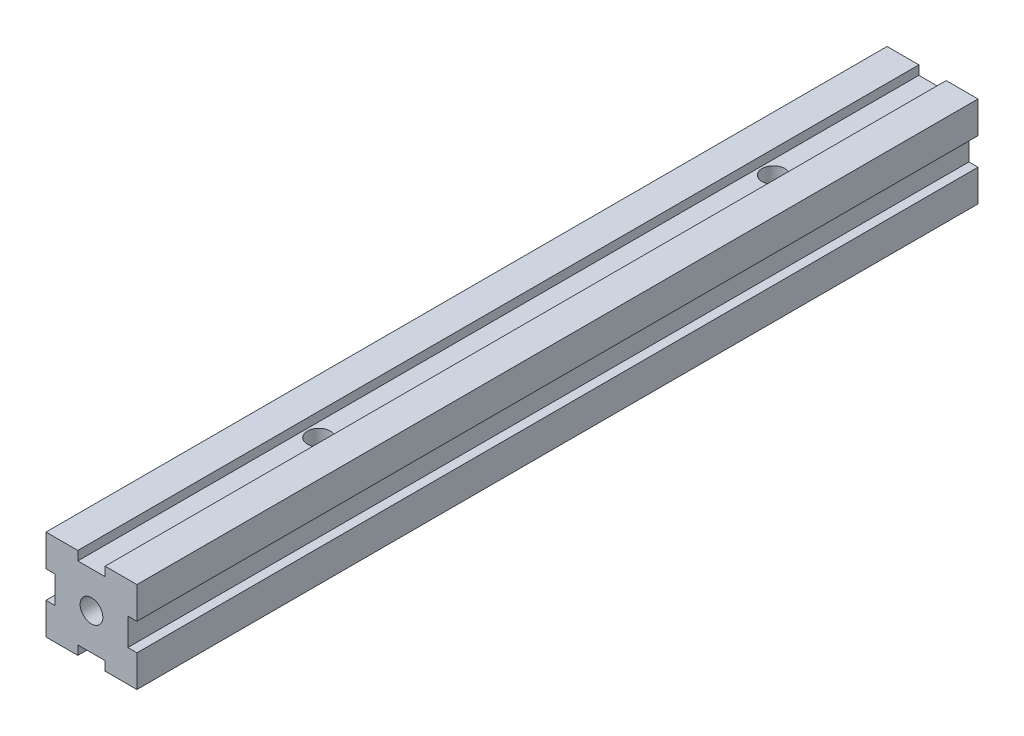
ISO-10303-21;
HEADER;
FILE_DESCRIPTION(('STEP AP214'),'2;1');
FILE_NAME('part.step','',(''),(''),'','','');
FILE_SCHEMA(('AUTOMOTIVE_DESIGN { 1 0 10303 214 1 1 1 1 }'));
ENDSEC;
DATA;
#1=APPLICATION_CONTEXT('core data for automotive mechanical design processes');
#2=APPLICATION_PROTOCOL_DEFINITION('international standard','automotive_design',2000,#1);
#3=PRODUCT_CONTEXT('',#1,'mechanical');
#4=PRODUCT('Part','Part','',(#3));
#5=PRODUCT_RELATED_PRODUCT_CATEGORY('part','',(#4));
#6=PRODUCT_DEFINITION_FORMATION('','',#4);
#7=PRODUCT_DEFINITION_CONTEXT('part definition',#1,'design');
#8=PRODUCT_DEFINITION('design','',#6,#7);
#9=PRODUCT_DEFINITION_SHAPE('','',#8);
#10=(LENGTH_UNIT() NAMED_UNIT(*) SI_UNIT(.MILLI.,.METRE.));
#11=(NAMED_UNIT(*) PLANE_ANGLE_UNIT() SI_UNIT($,.RADIAN.));
#12=(NAMED_UNIT(*) SI_UNIT($,.STERADIAN.) SOLID_ANGLE_UNIT());
#13=UNCERTAINTY_MEASURE_WITH_UNIT(LENGTH_MEASURE(1.E-05),#10,'distance_accuracy_value','');
#14=(GEOMETRIC_REPRESENTATION_CONTEXT(3) GLOBAL_UNCERTAINTY_ASSIGNED_CONTEXT((#13)) GLOBAL_UNIT_ASSIGNED_CONTEXT((#10,
#11,#12)) REPRESENTATION_CONTEXT('',''));
#15=CARTESIAN_POINT('',(0.,0.,0.));
#16=DIRECTION('',(0.,0.,1.));
#17=DIRECTION('',(1.,0.,0.));
#18=AXIS2_PLACEMENT_3D('',#15,#16,#17);
#19=CARTESIAN_POINT('',(10.,-10.,185.));
#20=DIRECTION('',(0.,0.,-1.));
#21=DIRECTION('',(-1.,0.,0.));
#22=AXIS2_PLACEMENT_3D('',#19,#20,#21);
#23=CYLINDRICAL_SURFACE('',#22,2.5);
#24=CARTESIAN_POINT('',(10.,-10.,135.));
#25=DIRECTION('',(0.,0.707106781186547,-0.707106781186547));
#26=DIRECTION('',(0.,-0.707106781186547,-0.707106781186547));
#27=AXIS2_PLACEMENT_3D('',#24,#25,#26);
#28=ELLIPSE('',#27,3.53553390593274,2.5);
#29=CARTESIAN_POINT('',(12.5,-10.,135.));
#30=VERTEX_POINT('',#29);
#31=CARTESIAN_POINT('',(7.5,-10.,135.));
#32=VERTEX_POINT('',#31);
#33=EDGE_CURVE('E189',#30,#32,#28,.F.);
#34=ORIENTED_EDGE('',*,*,#33,.F.);
#35=CARTESIAN_POINT('',(10.,-10.,135.));
#36=DIRECTION('',(0.,-0.707106781186547,-0.707106781186547));
#37=DIRECTION('',(0.,0.707106781186547,-0.707106781186547));
#38=AXIS2_PLACEMENT_3D('',#35,#36,#37);
#39=ELLIPSE('',#38,3.53553390593274,2.5);
#40=EDGE_CURVE('E56',#32,#30,#39,.F.);
#41=ORIENTED_EDGE('',*,*,#40,.F.);
#42=EDGE_LOOP('',(#34,#41));
#43=FACE_BOUND('',#42,.T.);
#44=CARTESIAN_POINT('',(10.,-10.,185.));
#45=DIRECTION('',(0.,0.,1.));
#46=DIRECTION('',(1.,0.,0.));
#47=AXIS2_PLACEMENT_3D('',#44,#45,#46);
#48=CIRCLE('',#47,2.5);
#49=CARTESIAN_POINT('',(12.5,-10.,185.));
#50=VERTEX_POINT('',#49);
#51=EDGE_CURVE('E224',#50,#50,#48,.T.);
#52=ORIENTED_EDGE('',*,*,#51,.T.);
#53=EDGE_LOOP('',(#52));
#54=FACE_BOUND('',#53,.T.);
#55=ADVANCED_FACE('F35',(#43,#54),#23,.F.);
#56=CARTESIAN_POINT('',(0.,0.,185.));
#57=DIRECTION('',(0.,0.,1.));
#58=DIRECTION('',(1.,0.,0.));
#59=AXIS2_PLACEMENT_3D('',#56,#57,#58);
#60=PLANE('',#59);
#61=DIRECTION('',(0.,-1.,0.));
#62=VECTOR('',#61,1.);
#63=CARTESIAN_POINT('',(0.,0.,185.));
#64=LINE('',#63,#62);
#65=CARTESIAN_POINT('',(0.,0.,185.));
#66=VERTEX_POINT('',#65);
#67=CARTESIAN_POINT('',(0.,-7.,185.));
#68=VERTEX_POINT('',#67);
#69=EDGE_CURVE('E234',#66,#68,#64,.T.);
#70=ORIENTED_EDGE('',*,*,#69,.T.);
#71=DIRECTION('',(1.,0.,0.));
#72=VECTOR('',#71,1.);
#73=CARTESIAN_POINT('',(0.,-7.,185.));
#74=LINE('',#73,#72);
#75=CARTESIAN_POINT('',(2.,-7.,185.));
#76=VERTEX_POINT('',#75);
#77=EDGE_CURVE('E237',#68,#76,#74,.T.);
#78=ORIENTED_EDGE('',*,*,#77,.T.);
#79=DIRECTION('',(0.,-1.,0.));
#80=VECTOR('',#79,1.);
#81=CARTESIAN_POINT('',(2.,-7.,185.));
#82=LINE('',#81,#80);
#83=CARTESIAN_POINT('',(2.,-13.,185.));
#84=VERTEX_POINT('',#83);
#85=EDGE_CURVE('E240',#76,#84,#82,.T.);
#86=ORIENTED_EDGE('',*,*,#85,.T.);
#87=DIRECTION('',(-1.,0.,0.));
#88=VECTOR('',#87,1.);
#89=CARTESIAN_POINT('',(0.,-13.,185.));
#90=LINE('',#89,#88);
#91=CARTESIAN_POINT('',(0.,-13.,185.));
#92=VERTEX_POINT('',#91);
#93=EDGE_CURVE('E242',#84,#92,#90,.T.);
#94=ORIENTED_EDGE('',*,*,#93,.T.);
#95=DIRECTION('',(0.,-1.,0.));
#96=VECTOR('',#95,1.);
#97=CARTESIAN_POINT('',(0.,-13.,185.));
#98=LINE('',#97,#96);
#99=CARTESIAN_POINT('',(0.,-20.,185.));
#100=VERTEX_POINT('',#99);
#101=EDGE_CURVE('E244',#92,#100,#98,.T.);
#102=ORIENTED_EDGE('',*,*,#101,.T.);
#103=DIRECTION('',(1.,0.,0.));
#104=VECTOR('',#103,1.);
#105=CARTESIAN_POINT('',(0.,-20.,185.));
#106=LINE('',#105,#104);
#107=CARTESIAN_POINT('',(7.,-20.,185.));
#108=VERTEX_POINT('',#107);
#109=EDGE_CURVE('E246',#100,#108,#106,.T.);
#110=ORIENTED_EDGE('',*,*,#109,.T.);
#111=DIRECTION('',(0.,1.,0.));
#112=VECTOR('',#111,1.);
#113=CARTESIAN_POINT('',(7.,-20.,185.));
#114=LINE('',#113,#112);
#115=CARTESIAN_POINT('',(7.,-18.,185.));
#116=VERTEX_POINT('',#115);
#117=EDGE_CURVE('E248',#108,#116,#114,.T.);
#118=ORIENTED_EDGE('',*,*,#117,.T.);
#119=DIRECTION('',(1.,0.,0.));
#120=VECTOR('',#119,1.);
#121=CARTESIAN_POINT('',(7.,-18.,185.));
#122=LINE('',#121,#120);
#123=CARTESIAN_POINT('',(13.,-18.,185.));
#124=VERTEX_POINT('',#123);
#125=EDGE_CURVE('E250',#116,#124,#122,.T.);
#126=ORIENTED_EDGE('',*,*,#125,.T.);
#127=DIRECTION('',(0.,-1.,0.));
#128=VECTOR('',#127,1.);
#129=CARTESIAN_POINT('',(13.,-20.,185.));
#130=LINE('',#129,#128);
#131=CARTESIAN_POINT('',(13.,-20.,185.));
#132=VERTEX_POINT('',#131);
#133=EDGE_CURVE('E252',#124,#132,#130,.T.);
#134=ORIENTED_EDGE('',*,*,#133,.T.);
#135=DIRECTION('',(1.,0.,0.));
#136=VECTOR('',#135,1.);
#137=CARTESIAN_POINT('',(13.,-20.,185.));
#138=LINE('',#137,#136);
#139=CARTESIAN_POINT('',(20.,-20.,185.));
#140=VERTEX_POINT('',#139);
#141=EDGE_CURVE('E254',#132,#140,#138,.T.);
#142=ORIENTED_EDGE('',*,*,#141,.T.);
#143=DIRECTION('',(0.,1.,0.));
#144=VECTOR('',#143,1.);
#145=CARTESIAN_POINT('',(20.,-13.,185.));
#146=LINE('',#145,#144);
#147=CARTESIAN_POINT('',(20.,-13.,185.));
#148=VERTEX_POINT('',#147);
#149=EDGE_CURVE('E256',#140,#148,#146,.T.);
#150=ORIENTED_EDGE('',*,*,#149,.T.);
#151=DIRECTION('',(-1.,0.,0.));
#152=VECTOR('',#151,1.);
#153=CARTESIAN_POINT('',(20.,-13.,185.));
#154=LINE('',#153,#152);
#155=CARTESIAN_POINT('',(18.,-13.,185.));
#156=VERTEX_POINT('',#155);
#157=EDGE_CURVE('E258',#148,#156,#154,.T.);
#158=ORIENTED_EDGE('',*,*,#157,.T.);
#159=DIRECTION('',(0.,1.,0.));
#160=VECTOR('',#159,1.);
#161=CARTESIAN_POINT('',(18.,-7.,185.));
#162=LINE('',#161,#160);
#163=CARTESIAN_POINT('',(18.,-7.,185.));
#164=VERTEX_POINT('',#163);
#165=EDGE_CURVE('E260',#156,#164,#162,.T.);
#166=ORIENTED_EDGE('',*,*,#165,.T.);
#167=DIRECTION('',(1.,0.,0.));
#168=VECTOR('',#167,1.);
#169=CARTESIAN_POINT('',(20.,-7.,185.));
#170=LINE('',#169,#168);
#171=CARTESIAN_POINT('',(20.,-7.,185.));
#172=VERTEX_POINT('',#171);
#173=EDGE_CURVE('E262',#164,#172,#170,.T.);
#174=ORIENTED_EDGE('',*,*,#173,.T.);
#175=DIRECTION('',(0.,1.,0.));
#176=VECTOR('',#175,1.);
#177=CARTESIAN_POINT('',(20.,0.,185.));
#178=LINE('',#177,#176);
#179=CARTESIAN_POINT('',(20.,0.,185.));
#180=VERTEX_POINT('',#179);
#181=EDGE_CURVE('E264',#172,#180,#178,.T.);
#182=ORIENTED_EDGE('',*,*,#181,.T.);
#183=DIRECTION('',(-1.,0.,0.));
#184=VECTOR('',#183,1.);
#185=CARTESIAN_POINT('',(13.,0.,185.));
#186=LINE('',#185,#184);
#187=CARTESIAN_POINT('',(13.,0.,185.));
#188=VERTEX_POINT('',#187);
#189=EDGE_CURVE('E266',#180,#188,#186,.T.);
#190=ORIENTED_EDGE('',*,*,#189,.T.);
#191=DIRECTION('',(0.,-1.,0.));
#192=VECTOR('',#191,1.);
#193=CARTESIAN_POINT('',(13.,0.,185.));
#194=LINE('',#193,#192);
#195=CARTESIAN_POINT('',(13.,-2.,185.));
#196=VERTEX_POINT('',#195);
#197=EDGE_CURVE('E268',#188,#196,#194,.T.);
#198=ORIENTED_EDGE('',*,*,#197,.T.);
#199=DIRECTION('',(-1.,0.,0.));
#200=VECTOR('',#199,1.);
#201=CARTESIAN_POINT('',(7.,-2.,185.));
#202=LINE('',#201,#200);
#203=CARTESIAN_POINT('',(7.,-2.,185.));
#204=VERTEX_POINT('',#203);
#205=EDGE_CURVE('E270',#196,#204,#202,.T.);
#206=ORIENTED_EDGE('',*,*,#205,.T.);
#207=DIRECTION('',(0.,1.,0.));
#208=VECTOR('',#207,1.);
#209=CARTESIAN_POINT('',(7.,0.,185.));
#210=LINE('',#209,#208);
#211=CARTESIAN_POINT('',(7.,0.,185.));
#212=VERTEX_POINT('',#211);
#213=EDGE_CURVE('E272',#204,#212,#210,.T.);
#214=ORIENTED_EDGE('',*,*,#213,.T.);
#215=DIRECTION('',(-1.,0.,0.));
#216=VECTOR('',#215,1.);
#217=CARTESIAN_POINT('',(0.,0.,185.));
#218=LINE('',#217,#216);
#219=EDGE_CURVE('E274',#212,#66,#218,.T.);
#220=ORIENTED_EDGE('',*,*,#219,.T.);
#221=EDGE_LOOP('',(#70,#78,#86,#94,#102,#110,#118,#126,#134,#142,#150,#158,#166,#174,#182,#190,
#198,#206,#214,#220));
#222=FACE_BOUND('',#221,.T.);
#223=ORIENTED_EDGE('',*,*,#51,.F.);
#224=EDGE_LOOP('',(#223));
#225=FACE_BOUND('',#224,.T.);
#226=ADVANCED_FACE('F398',(#222,#225),#60,.T.);
#227=CARTESIAN_POINT('',(0.,0.,0.));
#228=DIRECTION('',(0.,0.,1.));
#229=DIRECTION('',(1.,0.,0.));
#230=AXIS2_PLACEMENT_3D('',#227,#228,#229);
#231=PLANE('',#230);
#232=DIRECTION('',(0.,-1.,0.));
#233=VECTOR('',#232,1.);
#234=CARTESIAN_POINT('',(0.,0.,0.));
#235=LINE('',#234,#233);
#236=CARTESIAN_POINT('',(0.,0.,0.));
#237=VERTEX_POINT('',#236);
#238=CARTESIAN_POINT('',(0.,-7.,0.));
#239=VERTEX_POINT('',#238);
#240=EDGE_CURVE('E228',#237,#239,#235,.T.);
#241=ORIENTED_EDGE('',*,*,#240,.F.);
#242=DIRECTION('',(-1.,0.,0.));
#243=VECTOR('',#242,1.);
#244=CARTESIAN_POINT('',(0.,0.,0.));
#245=LINE('',#244,#243);
#246=CARTESIAN_POINT('',(7.,0.,0.));
#247=VERTEX_POINT('',#246);
#248=EDGE_CURVE('E238',#247,#237,#245,.T.);
#249=ORIENTED_EDGE('',*,*,#248,.F.);
#250=DIRECTION('',(0.,1.,0.));
#251=VECTOR('',#250,1.);
#252=CARTESIAN_POINT('',(7.,0.,0.));
#253=LINE('',#252,#251);
#254=CARTESIAN_POINT('',(7.,-2.,0.));
#255=VERTEX_POINT('',#254);
#256=EDGE_CURVE('E313',#255,#247,#253,.T.);
#257=ORIENTED_EDGE('',*,*,#256,.F.);
#258=DIRECTION('',(-1.,0.,0.));
#259=VECTOR('',#258,1.);
#260=CARTESIAN_POINT('',(7.,-2.,0.));
#261=LINE('',#260,#259);
#262=CARTESIAN_POINT('',(13.,-2.,0.));
#263=VERTEX_POINT('',#262);
#264=EDGE_CURVE('E311',#263,#255,#261,.T.);
#265=ORIENTED_EDGE('',*,*,#264,.F.);
#266=DIRECTION('',(0.,-1.,0.));
#267=VECTOR('',#266,1.);
#268=CARTESIAN_POINT('',(13.,0.,0.));
#269=LINE('',#268,#267);
#270=CARTESIAN_POINT('',(13.,0.,0.));
#271=VERTEX_POINT('',#270);
#272=EDGE_CURVE('E309',#271,#263,#269,.T.);
#273=ORIENTED_EDGE('',*,*,#272,.F.);
#274=DIRECTION('',(-1.,0.,0.));
#275=VECTOR('',#274,1.);
#276=CARTESIAN_POINT('',(13.,0.,0.));
#277=LINE('',#276,#275);
#278=CARTESIAN_POINT('',(20.,0.,0.));
#279=VERTEX_POINT('',#278);
#280=EDGE_CURVE('E307',#279,#271,#277,.T.);
#281=ORIENTED_EDGE('',*,*,#280,.F.);
#282=DIRECTION('',(0.,1.,0.));
#283=VECTOR('',#282,1.);
#284=CARTESIAN_POINT('',(20.,0.,0.));
#285=LINE('',#284,#283);
#286=CARTESIAN_POINT('',(20.,-7.,0.));
#287=VERTEX_POINT('',#286);
#288=EDGE_CURVE('E305',#287,#279,#285,.T.);
#289=ORIENTED_EDGE('',*,*,#288,.F.);
#290=DIRECTION('',(1.,0.,0.));
#291=VECTOR('',#290,1.);
#292=CARTESIAN_POINT('',(20.,-7.,0.));
#293=LINE('',#292,#291);
#294=CARTESIAN_POINT('',(18.,-7.,0.));
#295=VERTEX_POINT('',#294);
#296=EDGE_CURVE('E303',#295,#287,#293,.T.);
#297=ORIENTED_EDGE('',*,*,#296,.F.);
#298=DIRECTION('',(0.,1.,0.));
#299=VECTOR('',#298,1.);
#300=CARTESIAN_POINT('',(18.,-7.,0.));
#301=LINE('',#300,#299);
#302=CARTESIAN_POINT('',(18.,-13.,0.));
#303=VERTEX_POINT('',#302);
#304=EDGE_CURVE('E301',#303,#295,#301,.T.);
#305=ORIENTED_EDGE('',*,*,#304,.F.);
#306=DIRECTION('',(-1.,0.,0.));
#307=VECTOR('',#306,1.);
#308=CARTESIAN_POINT('',(20.,-13.,0.));
#309=LINE('',#308,#307);
#310=CARTESIAN_POINT('',(20.,-13.,0.));
#311=VERTEX_POINT('',#310);
#312=EDGE_CURVE('E299',#311,#303,#309,.T.);
#313=ORIENTED_EDGE('',*,*,#312,.F.);
#314=DIRECTION('',(0.,1.,0.));
#315=VECTOR('',#314,1.);
#316=CARTESIAN_POINT('',(20.,-13.,0.));
#317=LINE('',#316,#315);
#318=CARTESIAN_POINT('',(20.,-20.,0.));
#319=VERTEX_POINT('',#318);
#320=EDGE_CURVE('E297',#319,#311,#317,.T.);
#321=ORIENTED_EDGE('',*,*,#320,.F.);
#322=DIRECTION('',(1.,0.,0.));
#323=VECTOR('',#322,1.);
#324=CARTESIAN_POINT('',(13.,-20.,0.));
#325=LINE('',#324,#323);
#326=CARTESIAN_POINT('',(13.,-20.,0.));
#327=VERTEX_POINT('',#326);
#328=EDGE_CURVE('E295',#327,#319,#325,.T.);
#329=ORIENTED_EDGE('',*,*,#328,.F.);
#330=DIRECTION('',(0.,-1.,0.));
#331=VECTOR('',#330,1.);
#332=CARTESIAN_POINT('',(13.,-20.,0.));
#333=LINE('',#332,#331);
#334=CARTESIAN_POINT('',(13.,-18.,0.));
#335=VERTEX_POINT('',#334);
#336=EDGE_CURVE('E293',#335,#327,#333,.T.);
#337=ORIENTED_EDGE('',*,*,#336,.F.);
#338=DIRECTION('',(1.,0.,0.));
#339=VECTOR('',#338,1.);
#340=CARTESIAN_POINT('',(7.,-18.,0.));
#341=LINE('',#340,#339);
#342=CARTESIAN_POINT('',(7.,-18.,0.));
#343=VERTEX_POINT('',#342);
#344=EDGE_CURVE('E291',#343,#335,#341,.T.);
#345=ORIENTED_EDGE('',*,*,#344,.F.);
#346=DIRECTION('',(0.,1.,0.));
#347=VECTOR('',#346,1.);
#348=CARTESIAN_POINT('',(7.,-20.,0.));
#349=LINE('',#348,#347);
#350=CARTESIAN_POINT('',(7.,-20.,0.));
#351=VERTEX_POINT('',#350);
#352=EDGE_CURVE('E289',#351,#343,#349,.T.);
#353=ORIENTED_EDGE('',*,*,#352,.F.);
#354=DIRECTION('',(1.,0.,0.));
#355=VECTOR('',#354,1.);
#356=CARTESIAN_POINT('',(0.,-20.,0.));
#357=LINE('',#356,#355);
#358=CARTESIAN_POINT('',(0.,-20.,0.));
#359=VERTEX_POINT('',#358);
#360=EDGE_CURVE('E287',#359,#351,#357,.T.);
#361=ORIENTED_EDGE('',*,*,#360,.F.);
#362=DIRECTION('',(0.,-1.,0.));
#363=VECTOR('',#362,1.);
#364=CARTESIAN_POINT('',(0.,-13.,0.));
#365=LINE('',#364,#363);
#366=CARTESIAN_POINT('',(0.,-13.,0.));
#367=VERTEX_POINT('',#366);
#368=EDGE_CURVE('E285',#367,#359,#365,.T.);
#369=ORIENTED_EDGE('',*,*,#368,.F.);
#370=DIRECTION('',(-1.,0.,0.));
#371=VECTOR('',#370,1.);
#372=CARTESIAN_POINT('',(0.,-13.,0.));
#373=LINE('',#372,#371);
#374=CARTESIAN_POINT('',(2.,-13.,0.));
#375=VERTEX_POINT('',#374);
#376=EDGE_CURVE('E283',#375,#367,#373,.T.);
#377=ORIENTED_EDGE('',*,*,#376,.F.);
#378=DIRECTION('',(0.,-1.,0.));
#379=VECTOR('',#378,1.);
#380=CARTESIAN_POINT('',(2.,-7.,0.));
#381=LINE('',#380,#379);
#382=CARTESIAN_POINT('',(2.,-7.,0.));
#383=VERTEX_POINT('',#382);
#384=EDGE_CURVE('E281',#383,#375,#381,.T.);
#385=ORIENTED_EDGE('',*,*,#384,.F.);
#386=DIRECTION('',(1.,0.,0.));
#387=VECTOR('',#386,1.);
#388=CARTESIAN_POINT('',(0.,-7.,0.));
#389=LINE('',#388,#387);
#390=EDGE_CURVE('E279',#239,#383,#389,.T.);
#391=ORIENTED_EDGE('',*,*,#390,.F.);
#392=EDGE_LOOP('',(#241,#249,#257,#265,#273,#281,#289,#297,#305,#313,#321,#329,#337,#345,#353,
#361,#369,#377,#385,#391));
#393=FACE_BOUND('',#392,.T.);
#394=CARTESIAN_POINT('',(10.,-10.,0.));
#395=DIRECTION('',(0.,0.,1.));
#396=DIRECTION('',(1.,0.,0.));
#397=AXIS2_PLACEMENT_3D('',#394,#395,#396);
#398=CIRCLE('',#397,2.5);
#399=CARTESIAN_POINT('',(12.5,-10.,0.));
#400=VERTEX_POINT('',#399);
#401=EDGE_CURVE('E222',#400,#400,#398,.T.);
#402=ORIENTED_EDGE('',*,*,#401,.T.);
#403=EDGE_LOOP('',(#402));
#404=FACE_BOUND('',#403,.T.);
#405=ADVANCED_FACE('F383',(#393,#404),#231,.F.);
#406=CARTESIAN_POINT('',(0.,0.,185.));
#407=DIRECTION('',(1.,0.,0.));
#408=DIRECTION('',(0.,1.,0.));
#409=AXIS2_PLACEMENT_3D('',#406,#407,#408);
#410=PLANE('',#409);
#411=ORIENTED_EDGE('',*,*,#240,.T.);
#412=DIRECTION('',(0.,0.,-1.));
#413=VECTOR('',#412,1.);
#414=CARTESIAN_POINT('',(0.,-7.,185.));
#415=LINE('',#414,#413);
#416=EDGE_CURVE('E197',#68,#239,#415,.T.);
#417=ORIENTED_EDGE('',*,*,#416,.F.);
#418=ORIENTED_EDGE('',*,*,#69,.F.);
#419=DIRECTION('',(0.,0.,-1.));
#420=VECTOR('',#419,1.);
#421=CARTESIAN_POINT('',(0.,0.,185.));
#422=LINE('',#421,#420);
#423=EDGE_CURVE('E276',#66,#237,#422,.T.);
#424=ORIENTED_EDGE('',*,*,#423,.T.);
#425=EDGE_LOOP('',(#411,#417,#418,#424));
#426=FACE_BOUND('',#425,.T.);
#427=ADVANCED_FACE('F37',(#426),#410,.F.);
#428=CARTESIAN_POINT('',(0.,-7.,185.));
#429=DIRECTION('',(0.,1.,0.));
#430=DIRECTION('',(-1.,0.,0.));
#431=AXIS2_PLACEMENT_3D('',#428,#429,#430);
#432=PLANE('',#431);
#433=ORIENTED_EDGE('',*,*,#390,.T.);
#434=DIRECTION('',(0.,0.,-1.));
#435=VECTOR('',#434,1.);
#436=CARTESIAN_POINT('',(2.,-7.,185.));
#437=LINE('',#436,#435);
#438=EDGE_CURVE('E369',#76,#383,#437,.T.);
#439=ORIENTED_EDGE('',*,*,#438,.F.);
#440=ORIENTED_EDGE('',*,*,#77,.F.);
#441=ORIENTED_EDGE('',*,*,#416,.T.);
#442=EDGE_LOOP('',(#433,#439,#440,#441));
#443=FACE_BOUND('',#442,.T.);
#444=ADVANCED_FACE('F375',(#443),#432,.F.);
#445=CARTESIAN_POINT('',(2.,-7.,185.));
#446=DIRECTION('',(1.,0.,0.));
#447=DIRECTION('',(0.,0.,-1.));
#448=AXIS2_PLACEMENT_3D('',#445,#446,#447);
#449=PLANE('',#448);
#450=ORIENTED_EDGE('',*,*,#384,.T.);
#451=DIRECTION('',(0.,0.,-1.));
#452=VECTOR('',#451,1.);
#453=CARTESIAN_POINT('',(2.,-13.,185.));
#454=LINE('',#453,#452);
#455=EDGE_CURVE('E366',#84,#375,#454,.T.);
#456=ORIENTED_EDGE('',*,*,#455,.F.);
#457=ORIENTED_EDGE('',*,*,#85,.F.);
#458=ORIENTED_EDGE('',*,*,#438,.T.);
#459=EDGE_LOOP('',(#450,#456,#457,#458));
#460=FACE_BOUND('',#459,.T.);
#461=ADVANCED_FACE('F390',(#460),#449,.F.);
#462=CARTESIAN_POINT('',(0.,-13.,185.));
#463=DIRECTION('',(0.,-1.,0.));
#464=DIRECTION('',(1.,0.,0.));
#465=AXIS2_PLACEMENT_3D('',#462,#463,#464);
#466=PLANE('',#465);
#467=ORIENTED_EDGE('',*,*,#376,.T.);
#468=DIRECTION('',(0.,0.,-1.));
#469=VECTOR('',#468,1.);
#470=CARTESIAN_POINT('',(0.,-13.,185.));
#471=LINE('',#470,#469);
#472=EDGE_CURVE('E363',#92,#367,#471,.T.);
#473=ORIENTED_EDGE('',*,*,#472,.F.);
#474=ORIENTED_EDGE('',*,*,#93,.F.);
#475=ORIENTED_EDGE('',*,*,#455,.T.);
#476=EDGE_LOOP('',(#467,#473,#474,#475));
#477=FACE_BOUND('',#476,.T.);
#478=ADVANCED_FACE('F394',(#477),#466,.F.);
#479=CARTESIAN_POINT('',(0.,-13.,185.));
#480=DIRECTION('',(1.,0.,0.));
#481=DIRECTION('',(0.,1.,0.));
#482=AXIS2_PLACEMENT_3D('',#479,#480,#481);
#483=PLANE('',#482);
#484=ORIENTED_EDGE('',*,*,#368,.T.);
#485=DIRECTION('',(0.,0.,-1.));
#486=VECTOR('',#485,1.);
#487=CARTESIAN_POINT('',(0.,-20.,185.));
#488=LINE('',#487,#486);
#489=EDGE_CURVE('E360',#100,#359,#488,.T.);
#490=ORIENTED_EDGE('',*,*,#489,.F.);
#491=ORIENTED_EDGE('',*,*,#101,.F.);
#492=ORIENTED_EDGE('',*,*,#472,.T.);
#493=EDGE_LOOP('',(#484,#490,#491,#492));
#494=FACE_BOUND('',#493,.T.);
#495=ADVANCED_FACE('F473',(#494),#483,.F.);
#496=CARTESIAN_POINT('',(0.,-20.,185.));
#497=DIRECTION('',(0.,1.,0.));
#498=DIRECTION('',(0.,0.,1.));
#499=AXIS2_PLACEMENT_3D('',#496,#497,#498);
#500=PLANE('',#499);
#501=ORIENTED_EDGE('',*,*,#360,.T.);
#502=DIRECTION('',(0.,0.,-1.));
#503=VECTOR('',#502,1.);
#504=CARTESIAN_POINT('',(7.,-20.,185.));
#505=LINE('',#504,#503);
#506=EDGE_CURVE('E357',#108,#351,#505,.T.);
#507=ORIENTED_EDGE('',*,*,#506,.F.);
#508=ORIENTED_EDGE('',*,*,#109,.F.);
#509=ORIENTED_EDGE('',*,*,#489,.T.);
#510=EDGE_LOOP('',(#501,#507,#508,#509));
#511=FACE_BOUND('',#510,.T.);
#512=ADVANCED_FACE('F470',(#511),#500,.F.);
#513=CARTESIAN_POINT('',(7.,-20.,185.));
#514=DIRECTION('',(-1.,0.,0.));
#515=DIRECTION('',(0.,-1.,0.));
#516=AXIS2_PLACEMENT_3D('',#513,#514,#515);
#517=PLANE('',#516);
#518=ORIENTED_EDGE('',*,*,#352,.T.);
#519=DIRECTION('',(0.,0.,-1.));
#520=VECTOR('',#519,1.);
#521=CARTESIAN_POINT('',(7.,-18.,185.));
#522=LINE('',#521,#520);
#523=EDGE_CURVE('E354',#116,#343,#522,.T.);
#524=ORIENTED_EDGE('',*,*,#523,.F.);
#525=ORIENTED_EDGE('',*,*,#117,.F.);
#526=ORIENTED_EDGE('',*,*,#506,.T.);
#527=EDGE_LOOP('',(#518,#524,#525,#526));
#528=FACE_BOUND('',#527,.T.);
#529=ADVANCED_FACE('F466',(#528),#517,.F.);
#530=CARTESIAN_POINT('',(7.,-18.,185.));
#531=DIRECTION('',(0.,1.,0.));
#532=DIRECTION('',(0.,0.,1.));
#533=AXIS2_PLACEMENT_3D('',#530,#531,#532);
#534=PLANE('',#533);
#535=CARTESIAN_POINT('',(10.,-18.,35.));
#536=DIRECTION('',(0.,1.,0.));
#537=DIRECTION('',(0.,0.,1.));
#538=AXIS2_PLACEMENT_3D('',#535,#536,#537);
#539=CIRCLE('',#538,2.5);
#540=CARTESIAN_POINT('',(10.,-18.,37.5));
#541=VERTEX_POINT('',#540);
#542=EDGE_CURVE('E225',#541,#541,#539,.T.);
#543=ORIENTED_EDGE('',*,*,#542,.T.);
#544=EDGE_LOOP('',(#543));
#545=FACE_BOUND('',#544,.T.);
#546=CARTESIAN_POINT('',(10.,-18.,135.));
#547=DIRECTION('',(0.,1.,0.));
#548=DIRECTION('',(0.,0.,1.));
#549=AXIS2_PLACEMENT_3D('',#546,#547,#548);
#550=CIRCLE('',#549,2.5);
#551=CARTESIAN_POINT('',(10.,-18.,137.5));
#552=VERTEX_POINT('',#551);
#553=EDGE_CURVE('E704',#552,#552,#550,.T.);
#554=ORIENTED_EDGE('',*,*,#553,.T.);
#555=EDGE_LOOP('',(#554));
#556=FACE_BOUND('',#555,.T.);
#557=ORIENTED_EDGE('',*,*,#344,.T.);
#558=DIRECTION('',(0.,0.,-1.));
#559=VECTOR('',#558,1.);
#560=CARTESIAN_POINT('',(13.,-18.,185.));
#561=LINE('',#560,#559);
#562=EDGE_CURVE('E351',#124,#335,#561,.T.);
#563=ORIENTED_EDGE('',*,*,#562,.F.);
#564=ORIENTED_EDGE('',*,*,#125,.F.);
#565=ORIENTED_EDGE('',*,*,#523,.T.);
#566=EDGE_LOOP('',(#557,#563,#564,#565));
#567=FACE_BOUND('',#566,.T.);
#568=ADVANCED_FACE('F462',(#545,#556,#567),#534,.F.);
#569=CARTESIAN_POINT('',(13.,-20.,185.));
#570=DIRECTION('',(1.,0.,0.));
#571=DIRECTION('',(0.,1.,0.));
#572=AXIS2_PLACEMENT_3D('',#569,#570,#571);
#573=PLANE('',#572);
#574=ORIENTED_EDGE('',*,*,#336,.T.);
#575=DIRECTION('',(0.,0.,-1.));
#576=VECTOR('',#575,1.);
#577=CARTESIAN_POINT('',(13.,-20.,185.));
#578=LINE('',#577,#576);
#579=EDGE_CURVE('E348',#132,#327,#578,.T.);
#580=ORIENTED_EDGE('',*,*,#579,.F.);
#581=ORIENTED_EDGE('',*,*,#133,.F.);
#582=ORIENTED_EDGE('',*,*,#562,.T.);
#583=EDGE_LOOP('',(#574,#580,#581,#582));
#584=FACE_BOUND('',#583,.T.);
#585=ADVANCED_FACE('F457',(#584),#573,.F.);
#586=CARTESIAN_POINT('',(13.,-20.,185.));
#587=DIRECTION('',(0.,1.,0.));
#588=DIRECTION('',(0.,0.,1.));
#589=AXIS2_PLACEMENT_3D('',#586,#587,#588);
#590=PLANE('',#589);
#591=ORIENTED_EDGE('',*,*,#328,.T.);
#592=DIRECTION('',(0.,0.,-1.));
#593=VECTOR('',#592,1.);
#594=CARTESIAN_POINT('',(20.,-20.,185.));
#595=LINE('',#594,#593);
#596=EDGE_CURVE('E345',#140,#319,#595,.T.);
#597=ORIENTED_EDGE('',*,*,#596,.F.);
#598=ORIENTED_EDGE('',*,*,#141,.F.);
#599=ORIENTED_EDGE('',*,*,#579,.T.);
#600=EDGE_LOOP('',(#591,#597,#598,#599));
#601=FACE_BOUND('',#600,.T.);
#602=ADVANCED_FACE('F451',(#601),#590,.F.);
#603=CARTESIAN_POINT('',(20.,-13.,185.));
#604=DIRECTION('',(-1.,0.,0.));
#605=DIRECTION('',(0.,0.,1.));
#606=AXIS2_PLACEMENT_3D('',#603,#604,#605);
#607=PLANE('',#606);
#608=ORIENTED_EDGE('',*,*,#320,.T.);
#609=DIRECTION('',(0.,0.,-1.));
#610=VECTOR('',#609,1.);
#611=CARTESIAN_POINT('',(20.,-13.,185.));
#612=LINE('',#611,#610);
#613=EDGE_CURVE('E342',#148,#311,#612,.T.);
#614=ORIENTED_EDGE('',*,*,#613,.F.);
#615=ORIENTED_EDGE('',*,*,#149,.F.);
#616=ORIENTED_EDGE('',*,*,#596,.T.);
#617=EDGE_LOOP('',(#608,#614,#615,#616));
#618=FACE_BOUND('',#617,.T.);
#619=ADVANCED_FACE('F447',(#618),#607,.F.);
#620=CARTESIAN_POINT('',(20.,-13.,185.));
#621=DIRECTION('',(0.,-1.,0.));
#622=DIRECTION('',(1.,0.,0.));
#623=AXIS2_PLACEMENT_3D('',#620,#621,#622);
#624=PLANE('',#623);
#625=ORIENTED_EDGE('',*,*,#312,.T.);
#626=DIRECTION('',(0.,0.,-1.));
#627=VECTOR('',#626,1.);
#628=CARTESIAN_POINT('',(18.,-13.,185.));
#629=LINE('',#628,#627);
#630=EDGE_CURVE('E339',#156,#303,#629,.T.);
#631=ORIENTED_EDGE('',*,*,#630,.F.);
#632=ORIENTED_EDGE('',*,*,#157,.F.);
#633=ORIENTED_EDGE('',*,*,#613,.T.);
#634=EDGE_LOOP('',(#625,#631,#632,#633));
#635=FACE_BOUND('',#634,.T.);
#636=ADVANCED_FACE('F442',(#635),#624,.F.);
#637=CARTESIAN_POINT('',(18.,-7.,185.));
#638=DIRECTION('',(-1.,0.,0.));
#639=DIRECTION('',(0.,0.,1.));
#640=AXIS2_PLACEMENT_3D('',#637,#638,#639);
#641=PLANE('',#640);
#642=ORIENTED_EDGE('',*,*,#304,.T.);
#643=DIRECTION('',(0.,0.,-1.));
#644=VECTOR('',#643,1.);
#645=CARTESIAN_POINT('',(18.,-7.,185.));
#646=LINE('',#645,#644);
#647=EDGE_CURVE('E336',#164,#295,#646,.T.);
#648=ORIENTED_EDGE('',*,*,#647,.F.);
#649=ORIENTED_EDGE('',*,*,#165,.F.);
#650=ORIENTED_EDGE('',*,*,#630,.T.);
#651=EDGE_LOOP('',(#642,#648,#649,#650));
#652=FACE_BOUND('',#651,.T.);
#653=ADVANCED_FACE('F436',(#652),#641,.F.);
#654=CARTESIAN_POINT('',(20.,-7.,185.));
#655=DIRECTION('',(0.,1.,0.));
#656=DIRECTION('',(-1.,0.,0.));
#657=AXIS2_PLACEMENT_3D('',#654,#655,#656);
#658=PLANE('',#657);
#659=ORIENTED_EDGE('',*,*,#296,.T.);
#660=DIRECTION('',(0.,0.,-1.));
#661=VECTOR('',#660,1.);
#662=CARTESIAN_POINT('',(20.,-7.,185.));
#663=LINE('',#662,#661);
#664=EDGE_CURVE('E333',#172,#287,#663,.T.);
#665=ORIENTED_EDGE('',*,*,#664,.F.);
#666=ORIENTED_EDGE('',*,*,#173,.F.);
#667=ORIENTED_EDGE('',*,*,#647,.T.);
#668=EDGE_LOOP('',(#659,#665,#666,#667));
#669=FACE_BOUND('',#668,.T.);
#670=ADVANCED_FACE('F432',(#669),#658,.F.);
#671=CARTESIAN_POINT('',(20.,0.,185.));
#672=DIRECTION('',(-1.,0.,0.));
#673=DIRECTION('',(0.,-1.,0.));
#674=AXIS2_PLACEMENT_3D('',#671,#672,#673);
#675=PLANE('',#674);
#676=ORIENTED_EDGE('',*,*,#288,.T.);
#677=DIRECTION('',(0.,0.,-1.));
#678=VECTOR('',#677,1.);
#679=CARTESIAN_POINT('',(20.,0.,185.));
#680=LINE('',#679,#678);
#681=EDGE_CURVE('E330',#180,#279,#680,.T.);
#682=ORIENTED_EDGE('',*,*,#681,.F.);
#683=ORIENTED_EDGE('',*,*,#181,.F.);
#684=ORIENTED_EDGE('',*,*,#664,.T.);
#685=EDGE_LOOP('',(#676,#682,#683,#684));
#686=FACE_BOUND('',#685,.T.);
#687=ADVANCED_FACE('F427',(#686),#675,.F.);
#688=CARTESIAN_POINT('',(13.,0.,185.));
#689=DIRECTION('',(0.,-1.,0.));
#690=DIRECTION('',(0.,0.,-1.));
#691=AXIS2_PLACEMENT_3D('',#688,#689,#690);
#692=PLANE('',#691);
#693=ORIENTED_EDGE('',*,*,#280,.T.);
#694=DIRECTION('',(0.,0.,-1.));
#695=VECTOR('',#694,1.);
#696=CARTESIAN_POINT('',(13.,0.,185.));
#697=LINE('',#696,#695);
#698=EDGE_CURVE('E327',#188,#271,#697,.T.);
#699=ORIENTED_EDGE('',*,*,#698,.F.);
#700=ORIENTED_EDGE('',*,*,#189,.F.);
#701=ORIENTED_EDGE('',*,*,#681,.T.);
#702=EDGE_LOOP('',(#693,#699,#700,#701));
#703=FACE_BOUND('',#702,.T.);
#704=ADVANCED_FACE('F421',(#703),#692,.F.);
#705=CARTESIAN_POINT('',(13.,0.,185.));
#706=DIRECTION('',(1.,0.,0.));
#707=DIRECTION('',(0.,1.,0.));
#708=AXIS2_PLACEMENT_3D('',#705,#706,#707);
#709=PLANE('',#708);
#710=ORIENTED_EDGE('',*,*,#272,.T.);
#711=DIRECTION('',(0.,0.,-1.));
#712=VECTOR('',#711,1.);
#713=CARTESIAN_POINT('',(13.,-2.,185.));
#714=LINE('',#713,#712);
#715=EDGE_CURVE('E324',#196,#263,#714,.T.);
#716=ORIENTED_EDGE('',*,*,#715,.F.);
#717=ORIENTED_EDGE('',*,*,#197,.F.);
#718=ORIENTED_EDGE('',*,*,#698,.T.);
#719=EDGE_LOOP('',(#710,#716,#717,#718));
#720=FACE_BOUND('',#719,.T.);
#721=ADVANCED_FACE('F417',(#720),#709,.F.);
#722=CARTESIAN_POINT('',(7.,-2.,185.));
#723=DIRECTION('',(0.,-1.,0.));
#724=DIRECTION('',(0.,0.,-1.));
#725=AXIS2_PLACEMENT_3D('',#722,#723,#724);
#726=PLANE('',#725);
#727=CARTESIAN_POINT('',(10.,-2.,35.));
#728=DIRECTION('',(0.,-1.,0.));
#729=DIRECTION('',(0.,0.,-1.));
#730=AXIS2_PLACEMENT_3D('',#727,#728,#729);
#731=CIRCLE('',#730,2.5);
#732=CARTESIAN_POINT('',(10.,-2.,32.5));
#733=VERTEX_POINT('',#732);
#734=EDGE_CURVE('E231',#733,#733,#731,.T.);
#735=ORIENTED_EDGE('',*,*,#734,.T.);
#736=EDGE_LOOP('',(#735));
#737=FACE_BOUND('',#736,.T.);
#738=CARTESIAN_POINT('',(10.,-2.,135.));
#739=DIRECTION('',(0.,-1.,0.));
#740=DIRECTION('',(0.,0.,-1.));
#741=AXIS2_PLACEMENT_3D('',#738,#739,#740);
#742=CIRCLE('',#741,2.5);
#743=CARTESIAN_POINT('',(10.,-2.,132.5));
#744=VERTEX_POINT('',#743);
#745=EDGE_CURVE('E705',#744,#744,#742,.T.);
#746=ORIENTED_EDGE('',*,*,#745,.T.);
#747=EDGE_LOOP('',(#746));
#748=FACE_BOUND('',#747,.T.);
#749=ORIENTED_EDGE('',*,*,#264,.T.);
#750=DIRECTION('',(0.,0.,-1.));
#751=VECTOR('',#750,1.);
#752=CARTESIAN_POINT('',(7.,-2.,185.));
#753=LINE('',#752,#751);
#754=EDGE_CURVE('E321',#204,#255,#753,.T.);
#755=ORIENTED_EDGE('',*,*,#754,.F.);
#756=ORIENTED_EDGE('',*,*,#205,.F.);
#757=ORIENTED_EDGE('',*,*,#715,.T.);
#758=EDGE_LOOP('',(#749,#755,#756,#757));
#759=FACE_BOUND('',#758,.T.);
#760=ADVANCED_FACE('F412',(#737,#748,#759),#726,.F.);
#761=CARTESIAN_POINT('',(7.,0.,185.));
#762=DIRECTION('',(-1.,0.,0.));
#763=DIRECTION('',(0.,-1.,0.));
#764=AXIS2_PLACEMENT_3D('',#761,#762,#763);
#765=PLANE('',#764);
#766=ORIENTED_EDGE('',*,*,#256,.T.);
#767=DIRECTION('',(0.,0.,-1.));
#768=VECTOR('',#767,1.);
#769=CARTESIAN_POINT('',(7.,0.,185.));
#770=LINE('',#769,#768);
#771=EDGE_CURVE('E318',#212,#247,#770,.T.);
#772=ORIENTED_EDGE('',*,*,#771,.F.);
#773=ORIENTED_EDGE('',*,*,#213,.F.);
#774=ORIENTED_EDGE('',*,*,#754,.T.);
#775=EDGE_LOOP('',(#766,#772,#773,#774));
#776=FACE_BOUND('',#775,.T.);
#777=ADVANCED_FACE('F406',(#776),#765,.F.);
#778=CARTESIAN_POINT('',(0.,0.,185.));
#779=DIRECTION('',(0.,-1.,0.));
#780=DIRECTION('',(0.,0.,-1.));
#781=AXIS2_PLACEMENT_3D('',#778,#779,#780);
#782=PLANE('',#781);
#783=ORIENTED_EDGE('',*,*,#248,.T.);
#784=ORIENTED_EDGE('',*,*,#423,.F.);
#785=ORIENTED_EDGE('',*,*,#219,.F.);
#786=ORIENTED_EDGE('',*,*,#771,.T.);
#787=EDGE_LOOP('',(#783,#784,#785,#786));
#788=FACE_BOUND('',#787,.T.);
#789=ADVANCED_FACE('F218',(#788),#782,.F.);
#790=CARTESIAN_POINT('',(10.,-10.,35.));
#791=DIRECTION('',(0.,0.707106781186547,-0.707106781186547));
#792=DIRECTION('',(0.,-0.707106781186547,-0.707106781186547));
#793=AXIS2_PLACEMENT_3D('',#790,#791,#792);
#794=ELLIPSE('',#793,3.53553390593274,2.5);
#795=CARTESIAN_POINT('',(12.5,-10.,35.));
#796=VERTEX_POINT('',#795);
#797=CARTESIAN_POINT('',(7.50000000000001,-10.,35.));
#798=VERTEX_POINT('',#797);
#799=EDGE_CURVE('E43',#796,#798,#794,.T.);
#800=ORIENTED_EDGE('',*,*,#799,.F.);
#801=CARTESIAN_POINT('',(10.,-10.,35.));
#802=DIRECTION('',(0.,-0.707106781186547,-0.707106781186547));
#803=DIRECTION('',(0.,0.707106781186547,-0.707106781186547));
#804=AXIS2_PLACEMENT_3D('',#801,#802,#803);
#805=ELLIPSE('',#804,3.53553390593274,2.5);
#806=EDGE_CURVE('E205',#798,#796,#805,.T.);
#807=ORIENTED_EDGE('',*,*,#806,.F.);
#808=EDGE_LOOP('',(#800,#807));
#809=FACE_BOUND('',#808,.T.);
#810=ORIENTED_EDGE('',*,*,#401,.F.);
#811=EDGE_LOOP('',(#810));
#812=FACE_BOUND('',#811,.T.);
#813=ADVANCED_FACE('F215',(#809,#812),#23,.F.);
#814=CARTESIAN_POINT('',(10.,-20.,135.));
#815=DIRECTION('',(0.,1.,0.));
#816=DIRECTION('',(0.,0.,1.));
#817=AXIS2_PLACEMENT_3D('',#814,#815,#816);
#818=CYLINDRICAL_SURFACE('',#817,2.5);
#819=CARTESIAN_POINT('',(10.,-10.,135.));
#820=DIRECTION('',(0.,0.707106781186547,-0.707106781186547));
#821=DIRECTION('',(0.,-0.707106781186547,-0.707106781186547));
#822=AXIS2_PLACEMENT_3D('',#819,#820,#821);
#823=ELLIPSE('',#822,3.53553390593274,2.5);
#824=EDGE_CURVE('E192',#30,#32,#823,.T.);
#825=ORIENTED_EDGE('',*,*,#824,.T.);
#826=ORIENTED_EDGE('',*,*,#40,.T.);
#827=EDGE_LOOP('',(#825,#826));
#828=FACE_BOUND('',#827,.T.);
#829=ORIENTED_EDGE('',*,*,#553,.F.);
#830=EDGE_LOOP('',(#829));
#831=FACE_BOUND('',#830,.T.);
#832=ADVANCED_FACE('F195',(#828,#831),#818,.F.);
#833=CARTESIAN_POINT('',(10.,-10.,35.));
#834=DIRECTION('',(0.,0.707106781186547,-0.707106781186547));
#835=DIRECTION('',(0.,-0.707106781186547,-0.707106781186547));
#836=AXIS2_PLACEMENT_3D('',#833,#834,#835);
#837=ELLIPSE('',#836,3.53553390593274,2.5);
#838=EDGE_CURVE('E11',#796,#798,#837,.F.);
#839=ORIENTED_EDGE('',*,*,#838,.F.);
#840=CARTESIAN_POINT('',(10.,-10.,35.));
#841=DIRECTION('',(0.,-0.707106781186547,-0.707106781186547));
#842=DIRECTION('',(0.,0.707106781186547,-0.707106781186547));
#843=AXIS2_PLACEMENT_3D('',#840,#841,#842);
#844=ELLIPSE('',#843,3.53553390593274,2.5);
#845=EDGE_CURVE('E49',#798,#796,#844,.F.);
#846=ORIENTED_EDGE('',*,*,#845,.F.);
#847=EDGE_LOOP('',(#839,#846));
#848=FACE_BOUND('',#847,.T.);
#849=ORIENTED_EDGE('',*,*,#824,.F.);
#850=CARTESIAN_POINT('',(10.,-10.,135.));
#851=DIRECTION('',(0.,-0.707106781186547,-0.707106781186547));
#852=DIRECTION('',(0.,0.707106781186547,-0.707106781186547));
#853=AXIS2_PLACEMENT_3D('',#850,#851,#852);
#854=ELLIPSE('',#853,3.53553390593274,2.5);
#855=EDGE_CURVE('E186',#32,#30,#854,.T.);
#856=ORIENTED_EDGE('',*,*,#855,.F.);
#857=EDGE_LOOP('',(#849,#856));
#858=FACE_BOUND('',#857,.T.);
#859=ADVANCED_FACE('F201',(#848,#858),#23,.F.);
#860=ORIENTED_EDGE('',*,*,#33,.T.);
#861=ORIENTED_EDGE('',*,*,#855,.T.);
#862=EDGE_LOOP('',(#860,#861));
#863=FACE_BOUND('',#862,.T.);
#864=ORIENTED_EDGE('',*,*,#745,.F.);
#865=EDGE_LOOP('',(#864));
#866=FACE_BOUND('',#865,.T.);
#867=ADVANCED_FACE('F187',(#863,#866),#818,.F.);
#868=CARTESIAN_POINT('',(10.,-20.,35.));
#869=DIRECTION('',(0.,1.,0.));
#870=DIRECTION('',(0.,0.,1.));
#871=AXIS2_PLACEMENT_3D('',#868,#869,#870);
#872=CYLINDRICAL_SURFACE('',#871,2.5);
#873=ORIENTED_EDGE('',*,*,#799,.T.);
#874=ORIENTED_EDGE('',*,*,#845,.T.);
#875=EDGE_LOOP('',(#873,#874));
#876=FACE_BOUND('',#875,.T.);
#877=ORIENTED_EDGE('',*,*,#542,.F.);
#878=EDGE_LOOP('',(#877));
#879=FACE_BOUND('',#878,.T.);
#880=ADVANCED_FACE('F208',(#876,#879),#872,.F.);
#881=ORIENTED_EDGE('',*,*,#838,.T.);
#882=ORIENTED_EDGE('',*,*,#806,.T.);
#883=EDGE_LOOP('',(#881,#882));
#884=FACE_BOUND('',#883,.T.);
#885=ORIENTED_EDGE('',*,*,#734,.F.);
#886=EDGE_LOOP('',(#885));
#887=FACE_BOUND('',#886,.T.);
#888=ADVANCED_FACE('F213',(#884,#887),#872,.F.);
#889=CLOSED_SHELL('',(#55,#226,#405,#427,#444,#461,#478,#495,#512,#529,#568,#585,#602,#619,#636,
#653,#670,#687,#704,#721,#760,#777,#789,#813,#832,#859,#867,#880,#888));
#890=MANIFOLD_SOLID_BREP('B2',#889);
#891=ADVANCED_BREP_SHAPE_REPRESENTATION('',(#18,#890),#14);
#892=SHAPE_DEFINITION_REPRESENTATION(#9,#891);
ENDSEC;
END-ISO-10303-21;
